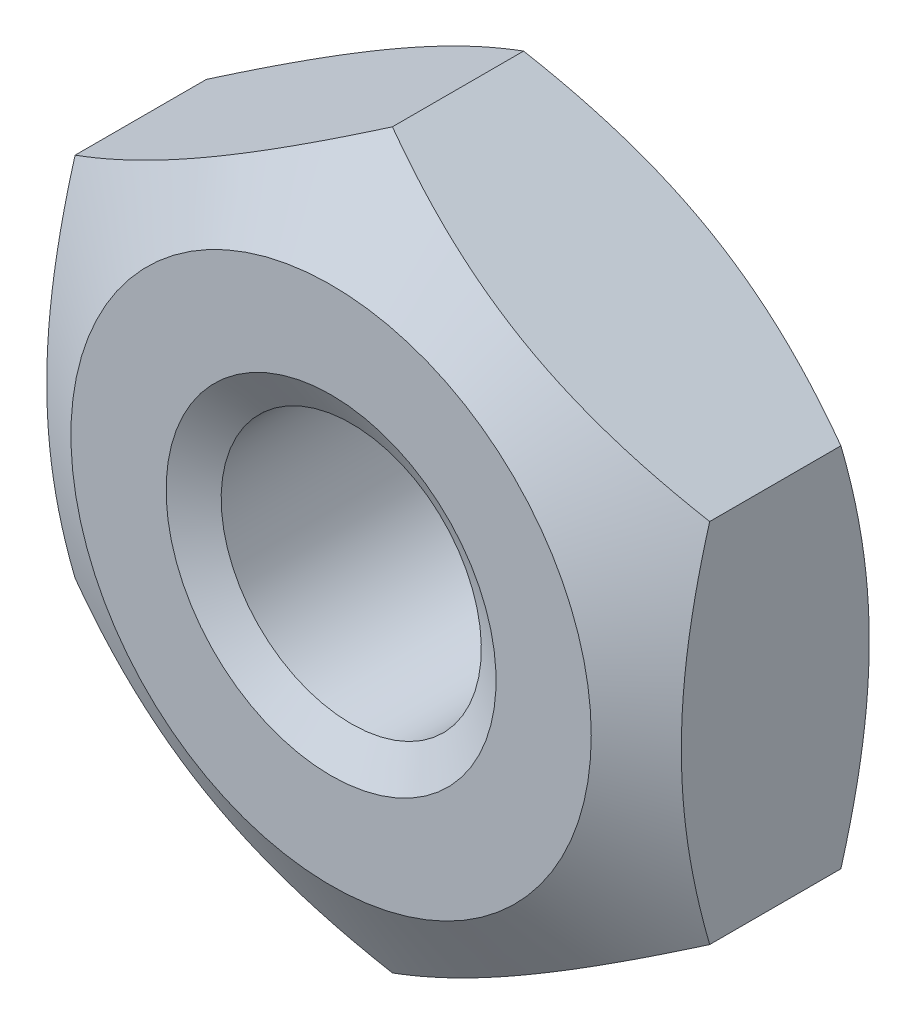
ISO-10303-21;
HEADER;
FILE_DESCRIPTION(('STEP AP214'),'2;1');
FILE_NAME('part.step','',(''),(''),'','','');
FILE_SCHEMA(('AUTOMOTIVE_DESIGN { 1 0 10303 214 1 1 1 1 }'));
ENDSEC;
DATA;
#1=APPLICATION_CONTEXT('core data for automotive mechanical design processes');
#2=APPLICATION_PROTOCOL_DEFINITION('international standard','automotive_design',2000,#1);
#3=PRODUCT_CONTEXT('',#1,'mechanical');
#4=PRODUCT('Part','Part','',(#3));
#5=PRODUCT_RELATED_PRODUCT_CATEGORY('part','',(#4));
#6=PRODUCT_DEFINITION_FORMATION('','',#4);
#7=PRODUCT_DEFINITION_CONTEXT('part definition',#1,'design');
#8=PRODUCT_DEFINITION('design','',#6,#7);
#9=PRODUCT_DEFINITION_SHAPE('','',#8);
#10=(LENGTH_UNIT() NAMED_UNIT(*) SI_UNIT(.MILLI.,.METRE.));
#11=(NAMED_UNIT(*) PLANE_ANGLE_UNIT() SI_UNIT($,.RADIAN.));
#12=(NAMED_UNIT(*) SI_UNIT($,.STERADIAN.) SOLID_ANGLE_UNIT());
#13=UNCERTAINTY_MEASURE_WITH_UNIT(LENGTH_MEASURE(1.E-05),#10,'distance_accuracy_value','');
#14=(GEOMETRIC_REPRESENTATION_CONTEXT(3) GLOBAL_UNCERTAINTY_ASSIGNED_CONTEXT((#13)) GLOBAL_UNIT_ASSIGNED_CONTEXT((#10,
#11,#12)) REPRESENTATION_CONTEXT('',''));
#15=CARTESIAN_POINT('',(0.,0.,0.));
#16=DIRECTION('',(0.,0.,1.));
#17=DIRECTION('',(1.,0.,0.));
#18=AXIS2_PLACEMENT_3D('',#15,#16,#17);
#19=CARTESIAN_POINT('',(0.,0.,0.));
#20=DIRECTION('',(0.,0.,1.));
#21=DIRECTION('',(1.,0.,0.));
#22=AXIS2_PLACEMENT_3D('',#19,#20,#21);
#23=PLANE('',#22);
#24=CARTESIAN_POINT('',(0.,0.,0.));
#25=DIRECTION('',(0.,0.,1.));
#26=DIRECTION('',(0.,-1.,0.));
#27=AXIS2_PLACEMENT_3D('',#24,#25,#26);
#28=CIRCLE('',#27,1.3);
#29=CARTESIAN_POINT('',(0.,-1.29999999999999,0.));
#30=VERTEX_POINT('',#29);
#31=EDGE_CURVE('E264',#30,#30,#28,.T.);
#32=ORIENTED_EDGE('',*,*,#31,.F.);
#33=EDGE_LOOP('',(#32));
#34=FACE_BOUND('',#33,.T.);
#35=CARTESIAN_POINT('',(0.,0.,0.));
#36=DIRECTION('',(0.,0.,1.));
#37=DIRECTION('',(1.,0.,0.));
#38=AXIS2_PLACEMENT_3D('',#35,#36,#37);
#39=CIRCLE('',#38,2.05);
#40=CARTESIAN_POINT('',(2.05,0.,0.));
#41=VERTEX_POINT('',#40);
#42=EDGE_CURVE('E223',#41,#41,#39,.T.);
#43=ORIENTED_EDGE('',*,*,#42,.T.);
#44=EDGE_LOOP('',(#43));
#45=FACE_BOUND('',#44,.T.);
#46=ADVANCED_FACE('F36',(#34,#45),#23,.T.);
#47=CARTESIAN_POINT('',(0.,0.,0.));
#48=DIRECTION('',(0.,0.,-1.));
#49=DIRECTION('',(-1.,0.,0.));
#50=AXIS2_PLACEMENT_3D('',#47,#48,#49);
#51=CONICAL_SURFACE('',#50,2.05,1.0471975511966);
#52=CARTESIAN_POINT('',(-2.5002,1.44326020292024,-0.48316528549444));
#53=CARTESIAN_POINT('',(-2.39033676526512,1.50668977106846,-0.446529241242958));
#54=CARTESIAN_POINT('',(-2.27952520010347,1.57066685804387,-0.413209840100388));
#55=CARTESIAN_POINT('',(-2.05598316653394,1.69972891130043,-0.35504990669319));
#56=CARTESIAN_POINT('',(-1.9432487254716,1.76481617119471,-0.330229950283071));
#57=CARTESIAN_POINT('',(-1.71917700612472,1.89418403867741,-0.291593272576385));
#58=CARTESIAN_POINT('',(-1.60787420823261,1.95844473900198,-0.277519417320972));
#59=CARTESIAN_POINT('',(-1.38474477253166,2.08726857876806,-0.260716773488084));
#60=CARTESIAN_POINT('',(-1.27291894598576,2.15183124982668,-0.25797407233896));
#61=CARTESIAN_POINT('',(-1.06395802444847,2.27247489412635,-0.263673381143387));
#62=CARTESIAN_POINT('',(-0.966791682442261,2.3285739078398,-0.270716015517195));
#63=CARTESIAN_POINT('',(-0.773092050288991,2.44040644260542,-0.293039040260275));
#64=CARTESIAN_POINT('',(-0.676559430340262,2.4961395767184,-0.308327059575599));
#65=CARTESIAN_POINT('',(-0.482460278259519,2.60820277442169,-0.346546714979751));
#66=CARTESIAN_POINT('',(-0.384918318217856,2.66451865130903,-0.369640397260847));
#67=CARTESIAN_POINT('',(-0.191289391923913,2.77631036402773,-0.422054277713241));
#68=CARTESIAN_POINT('',(-0.0951999441138227,2.83178763258717,-0.451362156759875));
#69=CARTESIAN_POINT('',(0.000200000000000249,2.88686681600196,-0.483165285494434));
#70=B_SPLINE_CURVE_WITH_KNOTS('',3,(#52,#53,#54,#55,#56,#57,#58,#59,#60,#61,#62,#63,#64,#65,#66,
#67,#68,#69),.UNSPECIFIED.,.F.,.F.,(4,2,2,2,2,2,2,2,4),(0.,0.396285827362227,0.793524330152051,
1.18093086852114,1.56786160134475,1.90479741793733,2.24204551660462,2.58677531536755,
2.93082800105255),.UNSPECIFIED.);
#71=CARTESIAN_POINT('',(-2.5,1.44337567297408,-0.483098614827935));
#72=VERTEX_POINT('',#71);
#73=CARTESIAN_POINT('',(0.,2.88675134594812,-0.483098614827928));
#74=VERTEX_POINT('',#73);
#75=EDGE_CURVE('E218',#72,#74,#70,.T.);
#76=ORIENTED_EDGE('',*,*,#75,.F.);
#77=CARTESIAN_POINT('',(-2.50000000000003,-3.7921269817919,-1.43878630039478));
#78=CARTESIAN_POINT('',(-2.50000000000003,-3.68360819419979,-1.38649250525917));
#79=CARTESIAN_POINT('',(-2.50000000000003,-3.57483093242934,-1.33472540231785));
#80=CARTESIAN_POINT('',(-2.50000000000003,-3.35662163311487,-1.23254270131456));
#81=CARTESIAN_POINT('',(-2.50000000000003,-3.24718948723902,-1.18212733486711));
#82=CARTESIAN_POINT('',(-2.50000000000003,-3.0269268935093,-1.08267410936104));
#83=CARTESIAN_POINT('',(-2.50000000000003,-2.91609201043438,-1.03364603733657));
#84=CARTESIAN_POINT('',(-2.50000000000003,-2.69351024653324,-0.93771366134557));
#85=CARTESIAN_POINT('',(-2.50000000000002,-2.58176341184402,-0.890809250716362));
#86=CARTESIAN_POINT('',(-2.50000000000002,-2.35393863753696,-0.798372730143281));
#87=CARTESIAN_POINT('',(-2.50000000000002,-2.23782867443053,-0.75291909527758));
#88=CARTESIAN_POINT('',(-2.50000000000002,-2.00421937372528,-0.66566233065449));
#89=CARTESIAN_POINT('',(-2.50000000000002,-1.88671987763637,-0.62385962197148));
#90=CARTESIAN_POINT('',(-2.50000000000002,-1.65039343421221,-0.545064724983018));
#91=CARTESIAN_POINT('',(-2.50000000000002,-1.53157003228562,-0.508062014902248));
#92=CARTESIAN_POINT('',(-2.50000000000001,-1.29222201525114,-0.440109887291416));
#93=CARTESIAN_POINT('',(-2.50000000000001,-1.17169797604213,-0.409158470924412));
#94=CARTESIAN_POINT('',(-2.50000000000001,-0.929521082816305,-0.355005530657451));
#95=CARTESIAN_POINT('',(-2.50000000000001,-0.807876882979509,-0.331766040628526));
#96=CARTESIAN_POINT('',(-2.50000000000001,-0.563169443541158,-0.294410848543932));
#97=CARTESIAN_POINT('',(-2.50000000000001,-0.440106312567164,-0.280294452720251));
#98=CARTESIAN_POINT('',(-2.50000000000001,-0.194745277219483,-0.262496926340283));
#99=CARTESIAN_POINT('',(-2.50000000000001,-0.0724568435156071,-0.258688404708268));
#100=CARTESIAN_POINT('',(-2.5,0.17200780348228,-0.261498957731729));
#101=CARTESIAN_POINT('',(-2.5,0.294184012050238,-0.268118453049466));
#102=CARTESIAN_POINT('',(-2.5,0.504206888974868,-0.288006807688305));
#103=CARTESIAN_POINT('',(-2.5,0.592284852724272,-0.298955989442029));
#104=CARTESIAN_POINT('',(-2.5,0.767736640735611,-0.325543939985937));
#105=CARTESIAN_POINT('',(-2.5,0.855110355995737,-0.341183420940635));
#106=CARTESIAN_POINT('',(-2.5,1.11608150013205,-0.394310701102382));
#107=CARTESIAN_POINT('',(-2.5,1.28841982922292,-0.437995705527644));
#108=CARTESIAN_POINT('',(-2.49999999999999,1.63319507258211,-0.538310530129978));
#109=CARTESIAN_POINT('',(-2.49999999999999,1.8055532783089,-0.595200225555468));
#110=CARTESIAN_POINT('',(-2.49999999999999,2.14711183996029,-0.717498880815936));
#111=CARTESIAN_POINT('',(-2.49999999999999,2.31631320938192,-0.782905050706423));
#112=CARTESIAN_POINT('',(-2.49999999999999,2.59299712145565,-0.895512640293348));
#113=CARTESIAN_POINT('',(-2.49999999999999,2.70119085712378,-0.940994238651021));
#114=CARTESIAN_POINT('',(-2.49999999999998,2.91672148538422,-1.03394823396382));
#115=CARTESIAN_POINT('',(-2.49999999999998,3.02405836362257,-1.08142066418611));
#116=CARTESIAN_POINT('',(-2.49999999999998,3.34503324191087,-1.22622555547707));
#117=CARTESIAN_POINT('',(-2.49999999999998,3.5575987877451,-1.32593034995251));
#118=CARTESIAN_POINT('',(-2.49999999999998,3.9808879083803,-1.52960150502348));
#119=CARTESIAN_POINT('',(-2.49999999999998,4.19160970797467,-1.63357151951237));
#120=CARTESIAN_POINT('',(-2.49999999999997,4.61159827267531,-1.84441771761189));
#121=CARTESIAN_POINT('',(-2.49999999999997,4.82086499524757,-1.9512939857318));
#122=CARTESIAN_POINT('',(-2.49999999999997,5.22194489802532,-2.15865703653318));
#123=CARTESIAN_POINT('',(-2.49999999999997,5.41383928810987,-2.25898724130076));
#124=CARTESIAN_POINT('',(-2.49999999999996,5.79692903660451,-2.46098529043429));
#125=CARTESIAN_POINT('',(-2.49999999999996,5.98812437472892,-2.56265317323055));
#126=CARTESIAN_POINT('',(-2.49999999999996,6.36955677188862,-2.76679618594544));
#127=CARTESIAN_POINT('',(-2.49999999999996,6.55979500596572,-2.86926912344229));
#128=CARTESIAN_POINT('',(-2.49999999999996,6.93982123367475,-3.0750254280534));
#129=CARTESIAN_POINT('',(-2.49999999999995,7.12960924820955,-3.17830875654413));
#130=CARTESIAN_POINT('',(-2.49999999999995,7.31922976990392,-3.28189662814873));
#131=B_SPLINE_CURVE_WITH_KNOTS('',3,(#77,#78,#79,#80,#81,#82,#83,#84,#85,#86,#87,#88,#89,#90,
#91,#92,#93,#94,#95,#96,#97,#98,#99,#100,#101,#102,#103,#104,#105,#106,#107,#108,#109,#110,#111,
#112,#113,#114,#115,#116,#117,#118,#119,#120,#121,#122,#123,#124,#125,#126,#127,#128,#129,#130),
.UNSPECIFIED.,.F.,.F.,(4,2,2,2,2,2,2,2,2,2,2,2,2,2,2,2,2,2,2,2,2,2,2,2,2,2,4),(0.,
0.361389297258786,0.722840126413439,1.0864060447768,1.44995368243466,1.8239758126449,
2.1980410233567,2.5712718910373,2.94437926565972,3.31562158220116,3.68683566420361,
4.05344064305347,4.42006041098822,4.68619830245561,4.9523766241806,5.4850609122767,
6.02928244820743,6.57332614696784,6.92540217640994,7.27748409145408,7.98176710566398,
8.68666660177973,9.3915866172274,10.041200667763,10.6908334220608,11.3390763206185,
11.9872885091277),.UNSPECIFIED.);
#132=CARTESIAN_POINT('',(-2.50000000000002,-1.44337567297406,-0.483098614827935));
#133=VERTEX_POINT('',#132);
#134=EDGE_CURVE('E186',#133,#72,#131,.T.);
#135=ORIENTED_EDGE('',*,*,#134,.F.);
#136=CARTESIAN_POINT('',(0.000199999999992317,-2.88686681600196,-0.483165285494434));
#137=CARTESIAN_POINT('',(-0.109663234734878,-2.82343724785374,-0.446529241242952));
#138=CARTESIAN_POINT('',(-0.220474799896532,-2.75946016087834,-0.413209840100383));
#139=CARTESIAN_POINT('',(-0.444016833466055,-2.63039810762177,-0.355049906693185));
#140=CARTESIAN_POINT('',(-0.556751274528393,-2.56531084772749,-0.330229950283065));
#141=CARTESIAN_POINT('',(-0.780822993875272,-2.43594298024479,-0.291593272576379));
#142=CARTESIAN_POINT('',(-0.89212579176738,-2.37168227992022,-0.277519417320966));
#143=CARTESIAN_POINT('',(-1.11525522746834,-2.24285844015414,-0.260716773488077));
#144=CARTESIAN_POINT('',(-1.22708105401423,-2.17829576909552,-0.257974072338954));
#145=CARTESIAN_POINT('',(-1.43604197555152,-2.05765212479585,-0.26367338114338));
#146=CARTESIAN_POINT('',(-1.53320831755773,-2.00155311108239,-0.270716015517188));
#147=CARTESIAN_POINT('',(-1.72690794971101,-1.88972057631676,-0.293039040260269));
#148=CARTESIAN_POINT('',(-1.82344056965974,-1.83398744220378,-0.308327059575594));
#149=CARTESIAN_POINT('',(-2.01753972174049,-1.72192424450049,-0.346546714979748));
#150=CARTESIAN_POINT('',(-2.11508168178215,-1.66560836761315,-0.369640397260845));
#151=CARTESIAN_POINT('',(-2.3087106080761,-1.55381665489444,-0.422054277713242));
#152=CARTESIAN_POINT('',(-2.40480005588619,-1.498339386335,-0.451362156759878));
#153=CARTESIAN_POINT('',(-2.50020000000002,-1.4432602029202,-0.483165285494438));
#154=B_SPLINE_CURVE_WITH_KNOTS('',3,(#136,#137,#138,#139,#140,#141,#142,#143,#144,#145,#146,
#147,#148,#149,#150,#151,#152,#153),.UNSPECIFIED.,.F.,.F.,(4,2,2,2,2,2,2,2,4),(0.,
0.396285827362226,0.793524330152048,1.18093086852114,1.56786160134475,1.90479741793733,
2.24204551660463,2.58677531536757,2.93082800105258),.UNSPECIFIED.);
#155=CARTESIAN_POINT('',(0.,-2.88675134594814,-0.483098614827935));
#156=VERTEX_POINT('',#155);
#157=EDGE_CURVE('E178',#156,#133,#154,.T.);
#158=ORIENTED_EDGE('',*,*,#157,.F.);
#159=CARTESIAN_POINT('',(2.50019999999999,-1.44326020292025,-0.483165285494439));
#160=CARTESIAN_POINT('',(2.39033676526512,-1.50668977106847,-0.446529241242956));
#161=CARTESIAN_POINT('',(2.27952520010346,-1.57066685804388,-0.413209840100387));
#162=CARTESIAN_POINT('',(2.05598316653394,-1.69972891130044,-0.355049906693189));
#163=CARTESIAN_POINT('',(1.9432487254716,-1.76481617119472,-0.33022995028307));
#164=CARTESIAN_POINT('',(1.71917700612472,-1.89418403867742,-0.291593272576384));
#165=CARTESIAN_POINT('',(1.60787420823261,-1.95844473900199,-0.277519417320972));
#166=CARTESIAN_POINT('',(1.38474477253165,-2.08726857876806,-0.260716773488083));
#167=CARTESIAN_POINT('',(1.27291894598576,-2.15183124982668,-0.25797407233896));
#168=CARTESIAN_POINT('',(1.06395802444846,-2.27247489412635,-0.263673381143387));
#169=CARTESIAN_POINT('',(0.966791682442253,-2.3285739078398,-0.270716015517194));
#170=CARTESIAN_POINT('',(0.773092050288983,-2.44040644260542,-0.293039040260274));
#171=CARTESIAN_POINT('',(0.676559430340254,-2.4961395767184,-0.308327059575599));
#172=CARTESIAN_POINT('',(0.482460278259512,-2.60820277442169,-0.346546714979751));
#173=CARTESIAN_POINT('',(0.384918318217849,-2.66451865130903,-0.369640397260847));
#174=CARTESIAN_POINT('',(0.191289391923906,-2.77631036402773,-0.422054277713241));
#175=CARTESIAN_POINT('',(0.0951999441138156,-2.83178763258717,-0.451362156759875));
#176=CARTESIAN_POINT('',(-0.000200000000007523,-2.88686681600196,-0.483165285494434));
#177=B_SPLINE_CURVE_WITH_KNOTS('',3,(#159,#160,#161,#162,#163,#164,#165,#166,#167,#168,#169,
#170,#171,#172,#173,#174,#175,#176),.UNSPECIFIED.,.F.,.F.,(4,2,2,2,2,2,2,2,4),(0.,
0.396285827362227,0.793524330152051,1.18093086852114,1.56786160134475,1.90479741793732,
2.24204551660462,2.58677531536754,2.93082800105254),.UNSPECIFIED.);
#178=CARTESIAN_POINT('',(2.5,-1.44337567297408,-0.483098614827935));
#179=VERTEX_POINT('',#178);
#180=EDGE_CURVE('E94',#179,#156,#177,.T.);
#181=ORIENTED_EDGE('',*,*,#180,.F.);
#182=CARTESIAN_POINT('',(2.49999999999997,-3.7921269818455,-1.43878630042059));
#183=CARTESIAN_POINT('',(2.49999999999997,-3.68360819425159,-1.3864925052839));
#184=CARTESIAN_POINT('',(2.49999999999997,-3.57483093247934,-1.33472540234149));
#185=CARTESIAN_POINT('',(2.49999999999997,-3.35662163316128,-1.23254270133603));
#186=CARTESIAN_POINT('',(2.49999999999998,-3.24718948728362,-1.18212733488749));
#187=CARTESIAN_POINT('',(2.49999999999998,-3.02692689355027,-1.08267410937926));
#188=CARTESIAN_POINT('',(2.49999999999998,-2.91609201047351,-1.03364603735371));
#189=CARTESIAN_POINT('',(2.49999999999998,-2.6935102465687,-0.937713661360553));
#190=CARTESIAN_POINT('',(2.49999999999998,-2.58176341187763,-0.890809250730278));
#191=CARTESIAN_POINT('',(2.49999999999998,-2.35393863756677,-0.79837273015505));
#192=CARTESIAN_POINT('',(2.49999999999998,-2.23782867445837,-0.75291909528827));
#193=CARTESIAN_POINT('',(2.49999999999998,-2.00421937374916,-0.665662330663084));
#194=CARTESIAN_POINT('',(2.49999999999999,-1.88671987765825,-0.623859621979055));
#195=CARTESIAN_POINT('',(2.49999999999999,-1.65039343423006,-0.54506472498866));
#196=CARTESIAN_POINT('',(2.49999999999999,-1.53157003230144,-0.508062014906974));
#197=CARTESIAN_POINT('',(2.49999999999999,-1.29222201526282,-0.44010988729447));
#198=CARTESIAN_POINT('',(2.49999999999999,-1.17169797605173,-0.409158470926709));
#199=CARTESIAN_POINT('',(2.49999999999999,-0.929521082820576,-0.355005530658232));
#200=CARTESIAN_POINT('',(2.49999999999999,-0.807876882980536,-0.331766040628615));
#201=CARTESIAN_POINT('',(2.49999999999999,-0.563169443535626,-0.294410848543136));
#202=CARTESIAN_POINT('',(2.5,-0.440106312558316,-0.280294452719263));
#203=CARTESIAN_POINT('',(2.5,-0.194745277204063,-0.262496926339493));
#204=CARTESIAN_POINT('',(2.5,-0.0724568434969307,-0.25868840470786));
#205=CARTESIAN_POINT('',(2.5,0.172007803507411,-0.261498957732634));
#206=CARTESIAN_POINT('',(2.5,0.294184012078567,-0.2681184530513));
#207=CARTESIAN_POINT('',(2.5,0.504206889007321,-0.288006807691996));
#208=CARTESIAN_POINT('',(2.5,0.592284852757687,-0.298955989446468));
#209=CARTESIAN_POINT('',(2.5,0.76773664077091,-0.325543939991914));
#210=CARTESIAN_POINT('',(2.5,0.855110356031959,-0.341183420947402));
#211=CARTESIAN_POINT('',(2.50000000000001,1.116081500171,-0.394310701111537));
#212=CARTESIAN_POINT('',(2.50000000000001,1.28841982926361,-0.437995705538415));
#213=CARTESIAN_POINT('',(2.50000000000001,1.63319507262632,-0.538310530143951));
#214=CARTESIAN_POINT('',(2.50000000000001,1.80555327835487,-0.595200225571028));
#215=CARTESIAN_POINT('',(2.50000000000001,2.14711184000977,-0.717498880834575));
#216=CARTESIAN_POINT('',(2.50000000000002,2.31631320943316,-0.782905050726551));
#217=CARTESIAN_POINT('',(2.50000000000002,2.59299712150841,-0.895512640315304));
#218=CARTESIAN_POINT('',(2.50000000000002,2.70119085717631,-0.940994238673306));
#219=CARTESIAN_POINT('',(2.50000000000002,2.91672148543633,-1.03394823398669));
#220=CARTESIAN_POINT('',(2.50000000000002,3.02405836367448,-1.08142066420923));
#221=CARTESIAN_POINT('',(2.50000000000002,3.34503324196222,-1.22622555550087));
#222=CARTESIAN_POINT('',(2.50000000000002,3.55759878779611,-1.32593034997665));
#223=CARTESIAN_POINT('',(2.50000000000003,3.98088790843069,-1.52960150504816));
#224=CARTESIAN_POINT('',(2.50000000000003,4.19160970802477,-1.63357151953725));
#225=CARTESIAN_POINT('',(2.50000000000003,4.61159827272488,-1.84441771763708));
#226=CARTESIAN_POINT('',(2.50000000000003,4.82086499529689,-1.95129398575711));
#227=CARTESIAN_POINT('',(2.50000000000004,5.22194489807436,-2.15865703655874));
#228=CARTESIAN_POINT('',(2.50000000000004,5.41383928815888,-2.25898724132647));
#229=CARTESIAN_POINT('',(2.50000000000004,5.79692903665347,-2.46098529046028));
#230=CARTESIAN_POINT('',(2.50000000000004,5.98812437477787,-2.56265317325665));
#231=CARTESIAN_POINT('',(2.50000000000004,6.36955677193757,-2.76679618597177));
#232=CARTESIAN_POINT('',(2.50000000000005,6.5597950060147,-2.86926912346874));
#233=CARTESIAN_POINT('',(2.50000000000005,6.93982123372379,-3.07502542808005));
#234=CARTESIAN_POINT('',(2.50000000000005,7.12960924825861,-3.17830875657088));
#235=CARTESIAN_POINT('',(2.50000000000005,7.31922976995302,-3.28189662817557));
#236=B_SPLINE_CURVE_WITH_KNOTS('',3,(#182,#183,#184,#185,#186,#187,#188,#189,#190,#191,#192,
#193,#194,#195,#196,#197,#198,#199,#200,#201,#202,#203,#204,#205,#206,#207,#208,#209,#210,#211,
#212,#213,#214,#215,#216,#217,#218,#219,#220,#221,#222,#223,#224,#225,#226,#227,#228,#229,#230,
#231,#232,#233,#234,#235),.UNSPECIFIED.,.F.,.F.,(4,2,2,2,2,2,2,2,2,2,2,2,2,2,2,2,2,2,2,2,2,2,2,
2,2,2,4),(0.,0.361389297265054,0.722840126425977,1.08640604479568,1.44995368245989,
1.82397581267679,2.19804102339526,2.5712718910825,2.94437926571156,3.31562158226293,
3.68683566427529,4.05344064313484,4.4200604110793,4.68619830254982,4.95237662427795,
5.48506091238034,6.02928244831759,6.57332614708452,6.92540217652639,7.27748409157029,
7.98176710577973,8.68666660189497,9.39158661734212,10.0412006678778,10.6908334221758,
11.3390763207337,11.9872885092431),.UNSPECIFIED.);
#237=CARTESIAN_POINT('',(2.50000000000001,1.44337567297407,-0.483098614827935));
#238=VERTEX_POINT('',#237);
#239=EDGE_CURVE('E90',#238,#179,#236,.F.);
#240=ORIENTED_EDGE('',*,*,#239,.F.);
#241=CARTESIAN_POINT('',(-0.0002,2.88686681600196,-0.483165285494434));
#242=CARTESIAN_POINT('',(0.10966323473487,2.82343724785374,-0.446529241242952));
#243=CARTESIAN_POINT('',(0.220474799896524,2.75946016087834,-0.413209840100382));
#244=CARTESIAN_POINT('',(0.444016833466046,2.63039810762177,-0.355049906693183));
#245=CARTESIAN_POINT('',(0.556751274528384,2.56531084772749,-0.330229950283063));
#246=CARTESIAN_POINT('',(0.780822993875262,2.43594298024478,-0.291593272576376));
#247=CARTESIAN_POINT('',(0.89212579176737,2.37168227992022,-0.277519417320962));
#248=CARTESIAN_POINT('',(1.11525522746832,2.24285844015414,-0.260716773488072));
#249=CARTESIAN_POINT('',(1.22708105401422,2.17829576909551,-0.257974072338948));
#250=CARTESIAN_POINT('',(1.43604197555151,2.05765212479584,-0.263673381143374));
#251=CARTESIAN_POINT('',(1.53320831755772,2.00155311108238,-0.270716015517181));
#252=CARTESIAN_POINT('',(1.726907949711,1.88972057631676,-0.293039040260262));
#253=CARTESIAN_POINT('',(1.82344056965973,1.83398744220377,-0.308327059575587));
#254=CARTESIAN_POINT('',(2.01753972174048,1.72192424450048,-0.34654671497974));
#255=CARTESIAN_POINT('',(2.11508168178214,1.66560836761313,-0.369640397260837));
#256=CARTESIAN_POINT('',(2.30871060807609,1.55381665489442,-0.422054277713234));
#257=CARTESIAN_POINT('',(2.40480005588618,1.49833938633498,-0.45136215675987));
#258=CARTESIAN_POINT('',(2.50020000000001,1.44326020292019,-0.483165285494431));
#259=B_SPLINE_CURVE_WITH_KNOTS('',3,(#241,#242,#243,#244,#245,#246,#247,#248,#249,#250,#251,
#252,#253,#254,#255,#256,#257,#258),.UNSPECIFIED.,.F.,.F.,(4,2,2,2,2,2,2,2,4),(0.,
0.396285827362225,0.793524330152049,1.18093086852114,1.56786160134475,1.90479741793733,
2.24204551660464,2.58677531536758,2.93082800105259),.UNSPECIFIED.);
#260=EDGE_CURVE('E62',#74,#238,#259,.T.);
#261=ORIENTED_EDGE('',*,*,#260,.F.);
#262=EDGE_LOOP('',(#76,#135,#158,#181,#240,#261));
#263=FACE_BOUND('',#262,.T.);
#264=ORIENTED_EDGE('',*,*,#42,.F.);
#265=EDGE_LOOP('',(#264));
#266=FACE_BOUND('',#265,.T.);
#267=ADVANCED_FACE('F91',(#263,#266),#51,.T.);
#268=CARTESIAN_POINT('',(2.50000000000001,1.44337567297403,-2.));
#269=DIRECTION('',(0.500000000000007,0.866025403784435,0.));
#270=DIRECTION('',(-0.866025403784435,0.500000000000007,0.));
#271=AXIS2_PLACEMENT_3D('',#268,#269,#270);
#272=PLANE('',#271);
#273=DIRECTION('',(0.,0.,1.));
#274=VECTOR('',#273,1.);
#275=CARTESIAN_POINT('',(2.50000000000001,1.44337567297403,-2.));
#276=LINE('',#275,#274);
#277=CARTESIAN_POINT('',(2.50000000000001,1.44337567297404,-1.51690138517207));
#278=VERTEX_POINT('',#277);
#279=EDGE_CURVE('E11',#278,#238,#276,.T.);
#280=ORIENTED_EDGE('',*,*,#279,.F.);
#281=CARTESIAN_POINT('',(2.50020000000001,1.44326020292019,-1.51683471450557));
#282=CARTESIAN_POINT('',(2.39033676526514,1.50668977106841,-1.55347075875705));
#283=CARTESIAN_POINT('',(2.27952520010349,1.57066685804382,-1.58679015989962));
#284=CARTESIAN_POINT('',(2.05598316653396,1.69972891130038,-1.64495009330682));
#285=CARTESIAN_POINT('',(1.94324872547163,1.76481617119466,-1.66977004971694));
#286=CARTESIAN_POINT('',(1.71917700612475,1.89418403867737,-1.70840672742362));
#287=CARTESIAN_POINT('',(1.60787420823264,1.95844473900194,-1.72248058267904));
#288=CARTESIAN_POINT('',(1.38474477253168,2.08726857876801,-1.73928322651193));
#289=CARTESIAN_POINT('',(1.27291894598579,2.15183124982664,-1.74202592766105));
#290=CARTESIAN_POINT('',(1.0639580244485,2.27247489412631,-1.73632661885662));
#291=CARTESIAN_POINT('',(0.966791682442286,2.32857390783977,-1.72928398448282));
#292=CARTESIAN_POINT('',(0.773092050289011,2.4404064426054,-1.70696095973974));
#293=CARTESIAN_POINT('',(0.67655943034028,2.49613957671838,-1.69167294042441));
#294=CARTESIAN_POINT('',(0.482460278259533,2.60820277442168,-1.65345328502026));
#295=CARTESIAN_POINT('',(0.384918318217866,2.66451865130902,-1.63035960273916));
#296=CARTESIAN_POINT('',(0.191289391923919,2.77631036402773,-1.57794572228676));
#297=CARTESIAN_POINT('',(0.0951999441138261,2.83178763258717,-1.54863784324012));
#298=CARTESIAN_POINT('',(-0.000199999999999743,2.88686681600196,-1.51683471450556));
#299=B_SPLINE_CURVE_WITH_KNOTS('',3,(#281,#282,#283,#284,#285,#286,#287,#288,#289,#290,#291,
#292,#293,#294,#295,#296,#297,#298),.UNSPECIFIED.,.F.,.F.,(4,2,2,2,2,2,2,2,4),(0.,
0.396285827362226,0.793524330152049,1.18093086852114,1.56786160134475,1.90479741793733,
2.24204551660464,2.58677531536758,2.93082800105259),.UNSPECIFIED.);
#300=CARTESIAN_POINT('',(0.,2.88675134594812,-1.51690138517207));
#301=VERTEX_POINT('',#300);
#302=EDGE_CURVE('E110',#278,#301,#299,.T.);
#303=ORIENTED_EDGE('',*,*,#302,.T.);
#304=DIRECTION('',(0.,0.,1.));
#305=VECTOR('',#304,1.);
#306=CARTESIAN_POINT('',(0.,2.88675134594812,-2.));
#307=LINE('',#306,#305);
#308=EDGE_CURVE('E41',#301,#74,#307,.T.);
#309=ORIENTED_EDGE('',*,*,#308,.T.);
#310=ORIENTED_EDGE('',*,*,#260,.T.);
#311=EDGE_LOOP('',(#280,#303,#309,#310));
#312=FACE_BOUND('',#311,.T.);
#313=ADVANCED_FACE('F38',(#312),#272,.T.);
#314=CARTESIAN_POINT('',(2.49999999999999,-1.44337567297409,-2.));
#315=DIRECTION('',(1.,0.,0.));
#316=DIRECTION('',(0.,1.,0.));
#317=AXIS2_PLACEMENT_3D('',#314,#315,#316);
#318=PLANE('',#317);
#319=DIRECTION('',(0.,0.,1.));
#320=VECTOR('',#319,1.);
#321=CARTESIAN_POINT('',(2.49999999999999,-1.44337567297409,-2.));
#322=LINE('',#321,#320);
#323=CARTESIAN_POINT('',(2.49999999999998,-1.4433756729741,-1.51690138517207));
#324=VERTEX_POINT('',#323);
#325=EDGE_CURVE('E46',#324,#179,#322,.T.);
#326=ORIENTED_EDGE('',*,*,#325,.F.);
#327=CARTESIAN_POINT('',(2.49999999999997,-3.7921269818455,-0.561213699579393));
#328=CARTESIAN_POINT('',(2.49999999999997,-3.68360819425159,-0.613507494716089));
#329=CARTESIAN_POINT('',(2.49999999999997,-3.57483093247934,-0.665274597658497));
#330=CARTESIAN_POINT('',(2.49999999999997,-3.35662163316127,-0.767457298663959));
#331=CARTESIAN_POINT('',(2.49999999999998,-3.24718948728362,-0.817872665112497));
#332=CARTESIAN_POINT('',(2.49999999999998,-3.02692689355027,-0.917325890620729));
#333=CARTESIAN_POINT('',(2.49999999999998,-2.91609201047351,-0.966353962646283));
#334=CARTESIAN_POINT('',(2.49999999999998,-2.6935102465687,-1.06228633863944));
#335=CARTESIAN_POINT('',(2.49999999999998,-2.58176341187763,-1.10919074926971));
#336=CARTESIAN_POINT('',(2.49999999999998,-2.35393863756677,-1.20162726984494));
#337=CARTESIAN_POINT('',(2.49999999999998,-2.23782867445837,-1.24708090471172));
#338=CARTESIAN_POINT('',(2.49999999999998,-2.00421937374916,-1.33433766933691));
#339=CARTESIAN_POINT('',(2.49999999999999,-1.88671987765825,-1.37614037802094));
#340=CARTESIAN_POINT('',(2.49999999999999,-1.65039343423006,-1.45493527501134));
#341=CARTESIAN_POINT('',(2.49999999999999,-1.53157003230144,-1.49193798509302));
#342=CARTESIAN_POINT('',(2.49999999999999,-1.29222201526282,-1.55989011270553));
#343=CARTESIAN_POINT('',(2.49999999999999,-1.17169797605173,-1.59084152907329));
#344=CARTESIAN_POINT('',(2.49999999999999,-0.929521082820575,-1.64499446934177));
#345=CARTESIAN_POINT('',(2.49999999999999,-0.807876882980535,-1.66823395937138));
#346=CARTESIAN_POINT('',(2.49999999999999,-0.563169443535624,-1.70558915145686));
#347=CARTESIAN_POINT('',(2.5,-0.440106312558314,-1.71970554728074));
#348=CARTESIAN_POINT('',(2.5,-0.19474527720406,-1.73750307366051));
#349=CARTESIAN_POINT('',(2.5,-0.0724568434969278,-1.74131159529214));
#350=CARTESIAN_POINT('',(2.5,0.172007803507414,-1.73850104226737));
#351=CARTESIAN_POINT('',(2.5,0.29418401207857,-1.7318815469487));
#352=CARTESIAN_POINT('',(2.5,0.504206889007323,-1.711993192308));
#353=CARTESIAN_POINT('',(2.5,0.592284852757688,-1.70104401055353));
#354=CARTESIAN_POINT('',(2.5,0.767736640770909,-1.67445606000808));
#355=CARTESIAN_POINT('',(2.5,0.855110356031957,-1.6588165790526));
#356=CARTESIAN_POINT('',(2.50000000000001,1.11608150017099,-1.60568929888846));
#357=CARTESIAN_POINT('',(2.50000000000001,1.28841982926361,-1.56200429446158));
#358=CARTESIAN_POINT('',(2.50000000000001,1.63319507262631,-1.46168946985605));
#359=CARTESIAN_POINT('',(2.50000000000001,1.80555327835485,-1.40479977442897));
#360=CARTESIAN_POINT('',(2.50000000000001,2.14711184000975,-1.28250111916543));
#361=CARTESIAN_POINT('',(2.50000000000002,2.31631320943314,-1.21709494927345));
#362=CARTESIAN_POINT('',(2.50000000000002,2.59299712150838,-1.1044873596847));
#363=CARTESIAN_POINT('',(2.50000000000002,2.70119085717629,-1.0590057613267));
#364=CARTESIAN_POINT('',(2.50000000000002,2.9167214854363,-0.966051766013316));
#365=CARTESIAN_POINT('',(2.50000000000002,3.02405836367446,-0.918579335790768));
#366=CARTESIAN_POINT('',(2.50000000000002,3.34503324196219,-0.77377444449913));
#367=CARTESIAN_POINT('',(2.50000000000002,3.55759878779608,-0.674069650023347));
#368=CARTESIAN_POINT('',(2.50000000000003,3.98088790843066,-0.470398494951839));
#369=CARTESIAN_POINT('',(2.50000000000003,4.19160970802474,-0.366428480462753));
#370=CARTESIAN_POINT('',(2.50000000000003,4.61159827272485,-0.155582282362916));
#371=CARTESIAN_POINT('',(2.50000000000003,4.82086499529686,-0.0487060142428898));
#372=CARTESIAN_POINT('',(2.50000000000004,5.22194489807433,0.158657036558749));
#373=CARTESIAN_POINT('',(2.50000000000004,5.41383928815885,0.25898724132648));
#374=CARTESIAN_POINT('',(2.50000000000004,5.79692903665344,0.460985290460286));
#375=CARTESIAN_POINT('',(2.50000000000004,5.98812437477784,0.562653173256661));
#376=CARTESIAN_POINT('',(2.50000000000004,6.36955677193754,0.766796185971783));
#377=CARTESIAN_POINT('',(2.50000000000005,6.55979500601467,0.869269123468753));
#378=CARTESIAN_POINT('',(2.50000000000005,6.93982123372375,1.07502542808007));
#379=CARTESIAN_POINT('',(2.50000000000005,7.12960924825858,1.1783087565709));
#380=CARTESIAN_POINT('',(2.50000000000005,7.31922976995298,1.28189662817559));
#381=B_SPLINE_CURVE_WITH_KNOTS('',3,(#327,#328,#329,#330,#331,#332,#333,#334,#335,#336,#337,
#338,#339,#340,#341,#342,#343,#344,#345,#346,#347,#348,#349,#350,#351,#352,#353,#354,#355,#356,
#357,#358,#359,#360,#361,#362,#363,#364,#365,#366,#367,#368,#369,#370,#371,#372,#373,#374,#375,
#376,#377,#378,#379,#380),.UNSPECIFIED.,.F.,.F.,(4,2,2,2,2,2,2,2,2,2,2,2,2,2,2,2,2,2,2,2,2,2,2,
2,2,2,4),(0.,0.361389297265055,0.722840126425978,1.08640604479568,1.44995368245989,
1.8239758126768,2.19804102339526,2.5712718910825,2.94437926571157,3.31562158226293,
3.6868356642753,4.05344064313485,4.4200604110793,4.68619830254982,4.95237662427795,
5.48506091238033,6.02928244831758,6.57332614708449,6.92540217652637,7.27748409157027,
7.98176710577971,8.68666660189495,9.3915866173421,10.0412006678778,10.6908334221758,
11.3390763207337,11.9872885092431),.UNSPECIFIED.);
#382=EDGE_CURVE('E108',#324,#278,#381,.T.);
#383=ORIENTED_EDGE('',*,*,#382,.T.);
#384=ORIENTED_EDGE('',*,*,#279,.T.);
#385=ORIENTED_EDGE('',*,*,#239,.T.);
#386=EDGE_LOOP('',(#326,#383,#384,#385));
#387=FACE_BOUND('',#386,.T.);
#388=ADVANCED_FACE('F107',(#387),#318,.T.);
#389=CARTESIAN_POINT('',(0.,-2.88675134594812,-2.));
#390=DIRECTION('',(0.499999999999993,-0.866025403784443,0.));
#391=DIRECTION('',(0.866025403784443,0.499999999999993,0.));
#392=AXIS2_PLACEMENT_3D('',#389,#390,#391);
#393=PLANE('',#392);
#394=DIRECTION('',(0.,0.,1.));
#395=VECTOR('',#394,1.);
#396=CARTESIAN_POINT('',(0.,-2.88675134594812,-2.));
#397=LINE('',#396,#395);
#398=CARTESIAN_POINT('',(0.,-2.88675134594812,-1.51690138517207));
#399=VERTEX_POINT('',#398);
#400=EDGE_CURVE('E207',#399,#156,#397,.T.);
#401=ORIENTED_EDGE('',*,*,#400,.F.);
#402=CARTESIAN_POINT('',(-0.000200000000007739,-2.88686681600196,-1.51683471450556));
#403=CARTESIAN_POINT('',(0.109663234734864,-2.82343724785374,-1.55347075875704));
#404=CARTESIAN_POINT('',(0.220474799896519,-2.75946016087834,-1.58679015989961));
#405=CARTESIAN_POINT('',(0.444016833466044,-2.63039810762178,-1.64495009330681));
#406=CARTESIAN_POINT('',(0.556751274528383,-2.5653108477275,-1.66977004971693));
#407=CARTESIAN_POINT('',(0.780822993875264,-2.43594298024479,-1.70840672742362));
#408=CARTESIAN_POINT('',(0.892125791767373,-2.37168227992023,-1.72248058267903));
#409=CARTESIAN_POINT('',(1.11525522746833,-2.24285844015415,-1.73928322651192));
#410=CARTESIAN_POINT('',(1.22708105401422,-2.17829576909553,-1.74202592766104));
#411=CARTESIAN_POINT('',(1.43604197555152,-2.05765212479587,-1.73632661885661));
#412=CARTESIAN_POINT('',(1.53320831755773,-2.00155311108241,-1.7292839844828));
#413=CARTESIAN_POINT('',(1.726907949711,-1.88972057631679,-1.70696095973972));
#414=CARTESIAN_POINT('',(1.82344056965973,-1.83398744220381,-1.6916729404244));
#415=CARTESIAN_POINT('',(2.01753972174047,-1.72192424450052,-1.65345328502024));
#416=CARTESIAN_POINT('',(2.11508168178213,-1.66560836761318,-1.63035960273915));
#417=CARTESIAN_POINT('',(2.30871060807607,-1.55381665489448,-1.57794572228675));
#418=CARTESIAN_POINT('',(2.40480005588616,-1.49833938633504,-1.54863784324012));
#419=CARTESIAN_POINT('',(2.50019999999999,-1.44326020292025,-1.51683471450556));
#420=B_SPLINE_CURVE_WITH_KNOTS('',3,(#402,#403,#404,#405,#406,#407,#408,#409,#410,#411,#412,
#413,#414,#415,#416,#417,#418,#419),.UNSPECIFIED.,.F.,.F.,(4,2,2,2,2,2,2,2,4),(0.,
0.396285827362227,0.79352433015205,1.18093086852114,1.56786160134475,1.90479741793732,
2.24204551660462,2.58677531536755,2.93082800105255),.UNSPECIFIED.);
#421=EDGE_CURVE('E111',#399,#324,#420,.T.);
#422=ORIENTED_EDGE('',*,*,#421,.T.);
#423=ORIENTED_EDGE('',*,*,#325,.T.);
#424=ORIENTED_EDGE('',*,*,#180,.T.);
#425=EDGE_LOOP('',(#401,#422,#423,#424));
#426=FACE_BOUND('',#425,.T.);
#427=ADVANCED_FACE('F172',(#426),#393,.T.);
#428=CARTESIAN_POINT('',(-2.50000000000002,-1.44337567297404,-2.));
#429=DIRECTION('',(-0.500000000000004,-0.866025403784436,0.));
#430=DIRECTION('',(0.866025403784437,-0.500000000000004,0.));
#431=AXIS2_PLACEMENT_3D('',#428,#429,#430);
#432=PLANE('',#431);
#433=DIRECTION('',(0.,0.,1.));
#434=VECTOR('',#433,1.);
#435=CARTESIAN_POINT('',(-2.50000000000002,-1.44337567297404,-2.));
#436=LINE('',#435,#434);
#437=CARTESIAN_POINT('',(-2.50000000000002,-1.44337567297403,-1.51690138517207));
#438=VERTEX_POINT('',#437);
#439=EDGE_CURVE('E210',#438,#133,#436,.T.);
#440=ORIENTED_EDGE('',*,*,#439,.F.);
#441=CARTESIAN_POINT('',(-2.50020000000002,-1.4432602029202,-1.51683471450556));
#442=CARTESIAN_POINT('',(-2.39033676526515,-1.50668977106842,-1.55347075875704));
#443=CARTESIAN_POINT('',(-2.27952520010349,-1.57066685804383,-1.58679015989961));
#444=CARTESIAN_POINT('',(-2.05598316653397,-1.69972891130039,-1.64495009330681));
#445=CARTESIAN_POINT('',(-1.94324872547163,-1.76481617119468,-1.66977004971693));
#446=CARTESIAN_POINT('',(-1.71917700612475,-1.89418403867738,-1.70840672742362));
#447=CARTESIAN_POINT('',(-1.60787420823264,-1.95844473900195,-1.72248058267903));
#448=CARTESIAN_POINT('',(-1.38474477253168,-2.08726857876803,-1.73928322651192));
#449=CARTESIAN_POINT('',(-1.27291894598579,-2.15183124982665,-1.74202592766105));
#450=CARTESIAN_POINT('',(-1.0639580244485,-2.27247489412632,-1.73632661885662));
#451=CARTESIAN_POINT('',(-0.966791682442286,-2.32857390783978,-1.72928398448281));
#452=CARTESIAN_POINT('',(-0.773092050289013,-2.4404064426054,-1.70696095973973));
#453=CARTESIAN_POINT('',(-0.676559430340282,-2.49613957671838,-1.69167294042441));
#454=CARTESIAN_POINT('',(-0.482460278259536,-2.60820277442168,-1.65345328502025));
#455=CARTESIAN_POINT('',(-0.38491831821787,-2.66451865130902,-1.63035960273916));
#456=CARTESIAN_POINT('',(-0.191289391923924,-2.77631036402773,-1.57794572228676));
#457=CARTESIAN_POINT('',(-0.0951999441138321,-2.83178763258717,-1.54863784324012));
#458=CARTESIAN_POINT('',(0.000199999999992434,-2.88686681600196,-1.51683471450556));
#459=B_SPLINE_CURVE_WITH_KNOTS('',3,(#441,#442,#443,#444,#445,#446,#447,#448,#449,#450,#451,
#452,#453,#454,#455,#456,#457,#458),.UNSPECIFIED.,.F.,.F.,(4,2,2,2,2,2,2,2,4),(0.,
0.396285827362227,0.793524330152052,1.18093086852114,1.56786160134476,1.90479741793734,
2.24204551660464,2.58677531536757,2.93082800105258),.UNSPECIFIED.);
#460=EDGE_CURVE('E114',#438,#399,#459,.T.);
#461=ORIENTED_EDGE('',*,*,#460,.T.);
#462=ORIENTED_EDGE('',*,*,#400,.T.);
#463=ORIENTED_EDGE('',*,*,#157,.T.);
#464=EDGE_LOOP('',(#440,#461,#462,#463));
#465=FACE_BOUND('',#464,.T.);
#466=ADVANCED_FACE('F168',(#465),#432,.T.);
#467=CARTESIAN_POINT('',(-2.5,1.44337567297408,-2.));
#468=DIRECTION('',(-1.,0.,0.));
#469=DIRECTION('',(0.,-1.,0.));
#470=AXIS2_PLACEMENT_3D('',#467,#468,#469);
#471=PLANE('',#470);
#472=DIRECTION('',(0.,0.,1.));
#473=VECTOR('',#472,1.);
#474=CARTESIAN_POINT('',(-2.5,1.44337567297408,-2.));
#475=LINE('',#474,#473);
#476=CARTESIAN_POINT('',(-2.5,1.44337567297408,-1.51690138517206));
#477=VERTEX_POINT('',#476);
#478=EDGE_CURVE('E213',#477,#72,#475,.T.);
#479=ORIENTED_EDGE('',*,*,#478,.F.);
#480=CARTESIAN_POINT('',(-2.50000000000003,-3.7921269817919,-0.561213699605209));
#481=CARTESIAN_POINT('',(-2.50000000000003,-3.68360819419979,-0.613507494740816));
#482=CARTESIAN_POINT('',(-2.50000000000003,-3.57483093242933,-0.665274597682136));
#483=CARTESIAN_POINT('',(-2.50000000000003,-3.35662163311487,-0.767457298685426));
#484=CARTESIAN_POINT('',(-2.50000000000003,-3.24718948723902,-0.817872665132881));
#485=CARTESIAN_POINT('',(-2.50000000000003,-3.0269268935093,-0.917325890638946));
#486=CARTESIAN_POINT('',(-2.50000000000003,-2.91609201043438,-0.966353962663415));
#487=CARTESIAN_POINT('',(-2.50000000000003,-2.69351024653324,-1.06228633865442));
#488=CARTESIAN_POINT('',(-2.50000000000002,-2.58176341184402,-1.10919074928363));
#489=CARTESIAN_POINT('',(-2.50000000000002,-2.35393863753696,-1.20162726985671));
#490=CARTESIAN_POINT('',(-2.50000000000002,-2.23782867443053,-1.24708090472241));
#491=CARTESIAN_POINT('',(-2.50000000000002,-2.00421937372528,-1.3343376693455));
#492=CARTESIAN_POINT('',(-2.50000000000002,-1.88671987763637,-1.37614037802851));
#493=CARTESIAN_POINT('',(-2.50000000000002,-1.65039343421221,-1.45493527501698));
#494=CARTESIAN_POINT('',(-2.50000000000002,-1.53157003228562,-1.49193798509775));
#495=CARTESIAN_POINT('',(-2.50000000000001,-1.29222201525114,-1.55989011270858));
#496=CARTESIAN_POINT('',(-2.50000000000001,-1.17169797604213,-1.59084152907559));
#497=CARTESIAN_POINT('',(-2.50000000000001,-0.929521082816304,-1.64499446934255));
#498=CARTESIAN_POINT('',(-2.50000000000001,-0.807876882979508,-1.66823395937147));
#499=CARTESIAN_POINT('',(-2.50000000000001,-0.563169443541157,-1.70558915145607));
#500=CARTESIAN_POINT('',(-2.50000000000001,-0.440106312567162,-1.71970554727975));
#501=CARTESIAN_POINT('',(-2.50000000000001,-0.194745277219481,-1.73750307365972));
#502=CARTESIAN_POINT('',(-2.50000000000001,-0.0724568435156044,-1.74131159529173));
#503=CARTESIAN_POINT('',(-2.5,0.172007803482283,-1.73850104226827));
#504=CARTESIAN_POINT('',(-2.5,0.294184012050241,-1.73188154695053));
#505=CARTESIAN_POINT('',(-2.5,0.50420688897487,-1.71199319231169));
#506=CARTESIAN_POINT('',(-2.5,0.592284852724273,-1.70104401055797));
#507=CARTESIAN_POINT('',(-2.5,0.76773664073561,-1.67445606001406));
#508=CARTESIAN_POINT('',(-2.5,0.855110355995735,-1.65881657905936));
#509=CARTESIAN_POINT('',(-2.5,1.11608150013205,-1.60568929889762));
#510=CARTESIAN_POINT('',(-2.5,1.28841982922291,-1.56200429447235));
#511=CARTESIAN_POINT('',(-2.49999999999999,1.6331950725821,-1.46168946987002));
#512=CARTESIAN_POINT('',(-2.49999999999999,1.80555327830888,-1.40479977444453));
#513=CARTESIAN_POINT('',(-2.49999999999999,2.14711183996027,-1.28250111918407));
#514=CARTESIAN_POINT('',(-2.49999999999999,2.3163132093819,-1.21709494929358));
#515=CARTESIAN_POINT('',(-2.49999999999999,2.59299712145563,-1.10448735970665));
#516=CARTESIAN_POINT('',(-2.49999999999999,2.70119085712376,-1.05900576134898));
#517=CARTESIAN_POINT('',(-2.49999999999998,2.91672148538419,-0.966051766036185));
#518=CARTESIAN_POINT('',(-2.49999999999998,3.02405836362255,-0.918579335813892));
#519=CARTESIAN_POINT('',(-2.49999999999998,3.34503324191084,-0.773774444522932));
#520=CARTESIAN_POINT('',(-2.49999999999998,3.55759878774507,-0.674069650047487));
#521=CARTESIAN_POINT('',(-2.49999999999998,3.98088790838027,-0.470398494976518));
#522=CARTESIAN_POINT('',(-2.49999999999998,4.19160970797464,-0.36642848048763));
#523=CARTESIAN_POINT('',(-2.49999999999997,4.61159827267528,-0.155582282388106));
#524=CARTESIAN_POINT('',(-2.49999999999997,4.82086499524755,-0.0487060142681935));
#525=CARTESIAN_POINT('',(-2.49999999999997,5.22194489802529,0.158657036533187));
#526=CARTESIAN_POINT('',(-2.49999999999997,5.41383928810984,0.258987241300768));
#527=CARTESIAN_POINT('',(-2.49999999999996,5.79692903660448,0.460985290434303));
#528=CARTESIAN_POINT('',(-2.49999999999996,5.98812437472889,0.562653173230557));
#529=CARTESIAN_POINT('',(-2.49999999999996,6.36955677188858,0.766796185945448));
#530=CARTESIAN_POINT('',(-2.49999999999996,6.55979500596569,0.869269123442306));
#531=CARTESIAN_POINT('',(-2.49999999999996,6.93982123367472,1.07502542805341));
#532=CARTESIAN_POINT('',(-2.49999999999995,7.12960924820951,1.17830875654414));
#533=CARTESIAN_POINT('',(-2.49999999999995,7.31922976990388,1.28189662814874));
#534=B_SPLINE_CURVE_WITH_KNOTS('',3,(#480,#481,#482,#483,#484,#485,#486,#487,#488,#489,#490,
#491,#492,#493,#494,#495,#496,#497,#498,#499,#500,#501,#502,#503,#504,#505,#506,#507,#508,#509,
#510,#511,#512,#513,#514,#515,#516,#517,#518,#519,#520,#521,#522,#523,#524,#525,#526,#527,#528,
#529,#530,#531,#532,#533),.UNSPECIFIED.,.F.,.F.,(4,2,2,2,2,2,2,2,2,2,2,2,2,2,2,2,2,2,2,2,2,2,2,
2,2,2,4),(0.,0.361389297258786,0.72284012641344,1.0864060447768,1.44995368243466,
1.8239758126449,2.1980410233567,2.5712718910373,2.94437926565973,3.31562158220116,
3.68683566420361,4.05344064305347,4.42006041098823,4.68619830245561,4.9523766241806,
5.48506091227669,6.02928244820741,6.57332614696781,6.92540217640992,7.27748409145406,
7.98176710566396,8.68666660177971,9.39158661722737,10.041200667763,10.6908334220608,
11.3390763206185,11.9872885091277),.UNSPECIFIED.);
#535=EDGE_CURVE('E54',#477,#438,#534,.F.);
#536=ORIENTED_EDGE('',*,*,#535,.T.);
#537=ORIENTED_EDGE('',*,*,#439,.T.);
#538=ORIENTED_EDGE('',*,*,#134,.T.);
#539=EDGE_LOOP('',(#479,#536,#537,#538));
#540=FACE_BOUND('',#539,.T.);
#541=ADVANCED_FACE('F171',(#540),#471,.T.);
#542=CARTESIAN_POINT('',(0.,2.88675134594812,-2.));
#543=DIRECTION('',(-0.499999999999995,0.866025403784442,0.));
#544=DIRECTION('',(-0.866025403784442,-0.499999999999995,0.));
#545=AXIS2_PLACEMENT_3D('',#542,#543,#544);
#546=PLANE('',#545);
#547=ORIENTED_EDGE('',*,*,#308,.F.);
#548=CARTESIAN_POINT('',(0.000200000000000056,2.88686681600196,-1.51683471450556));
#549=CARTESIAN_POINT('',(-0.109663234734871,2.82343724785374,-1.55347075875704));
#550=CARTESIAN_POINT('',(-0.220474799896526,2.75946016087834,-1.58679015989961));
#551=CARTESIAN_POINT('',(-0.444016833466051,2.63039810762178,-1.64495009330681));
#552=CARTESIAN_POINT('',(-0.55675127452839,2.5653108477275,-1.66977004971693));
#553=CARTESIAN_POINT('',(-0.780822993875271,2.43594298024479,-1.70840672742362));
#554=CARTESIAN_POINT('',(-0.892125791767379,2.37168227992023,-1.72248058267903));
#555=CARTESIAN_POINT('',(-1.11525522746834,2.24285844015415,-1.73928322651192));
#556=CARTESIAN_POINT('',(-1.22708105401423,2.17829576909553,-1.74202592766104));
#557=CARTESIAN_POINT('',(-1.43604197555152,2.05765212479586,-1.73632661885661));
#558=CARTESIAN_POINT('',(-1.53320831755773,2.00155311108241,-1.7292839844828));
#559=CARTESIAN_POINT('',(-1.726907949711,1.88972057631679,-1.70696095973972));
#560=CARTESIAN_POINT('',(-1.82344056965973,1.83398744220381,-1.6916729404244));
#561=CARTESIAN_POINT('',(-2.01753972174047,1.72192424450051,-1.65345328502024));
#562=CARTESIAN_POINT('',(-2.11508168178214,1.66560836761318,-1.63035960273915));
#563=CARTESIAN_POINT('',(-2.30871060807608,1.55381665489447,-1.57794572228675));
#564=CARTESIAN_POINT('',(-2.40480005588617,1.49833938633503,-1.54863784324012));
#565=CARTESIAN_POINT('',(-2.5002,1.44326020292024,-1.51683471450556));
#566=B_SPLINE_CURVE_WITH_KNOTS('',3,(#548,#549,#550,#551,#552,#553,#554,#555,#556,#557,#558,
#559,#560,#561,#562,#563,#564,#565),.UNSPECIFIED.,.F.,.F.,(4,2,2,2,2,2,2,2,4),(0.,
0.396285827362226,0.79352433015205,1.18093086852114,1.56786160134475,1.90479741793732,
2.24204551660462,2.58677531536755,2.93082800105255),.UNSPECIFIED.);
#567=EDGE_CURVE('E104',#301,#477,#566,.T.);
#568=ORIENTED_EDGE('',*,*,#567,.T.);
#569=ORIENTED_EDGE('',*,*,#478,.T.);
#570=ORIENTED_EDGE('',*,*,#75,.T.);
#571=EDGE_LOOP('',(#547,#568,#569,#570));
#572=FACE_BOUND('',#571,.T.);
#573=ADVANCED_FACE('F140',(#572),#546,.T.);
#574=CARTESIAN_POINT('',(0.,0.,-1.51690138517207));
#575=DIRECTION('',(0.,0.,1.));
#576=DIRECTION('',(1.,0.,0.));
#577=AXIS2_PLACEMENT_3D('',#574,#575,#576);
#578=CONICAL_SURFACE('',#577,2.88675134594812,1.0471975511966);
#579=CARTESIAN_POINT('',(0.,0.,-2.));
#580=DIRECTION('',(0.,0.,1.));
#581=DIRECTION('',(1.,0.,0.));
#582=AXIS2_PLACEMENT_3D('',#579,#580,#581);
#583=CIRCLE('',#582,2.05);
#584=CARTESIAN_POINT('',(2.05,0.,-2.));
#585=VERTEX_POINT('',#584);
#586=EDGE_CURVE('E221',#585,#585,#583,.T.);
#587=ORIENTED_EDGE('',*,*,#586,.T.);
#588=EDGE_LOOP('',(#587));
#589=FACE_BOUND('',#588,.T.);
#590=ORIENTED_EDGE('',*,*,#382,.F.);
#591=ORIENTED_EDGE('',*,*,#421,.F.);
#592=ORIENTED_EDGE('',*,*,#460,.F.);
#593=ORIENTED_EDGE('',*,*,#535,.F.);
#594=ORIENTED_EDGE('',*,*,#567,.F.);
#595=ORIENTED_EDGE('',*,*,#302,.F.);
#596=EDGE_LOOP('',(#590,#591,#592,#593,#594,#595));
#597=FACE_BOUND('',#596,.T.);
#598=ADVANCED_FACE('F134',(#589,#597),#578,.T.);
#599=CARTESIAN_POINT('',(0.,0.,-2.));
#600=DIRECTION('',(0.,0.,1.));
#601=DIRECTION('',(1.,0.,0.));
#602=AXIS2_PLACEMENT_3D('',#599,#600,#601);
#603=PLANE('',#602);
#604=CARTESIAN_POINT('',(0.,0.,-2.));
#605=DIRECTION('',(0.,0.,1.));
#606=DIRECTION('',(0.,-1.,0.));
#607=AXIS2_PLACEMENT_3D('',#604,#605,#606);
#608=CIRCLE('',#607,1.29999999999999);
#609=CARTESIAN_POINT('',(0.,-1.29999999999999,-2.));
#610=VERTEX_POINT('',#609);
#611=EDGE_CURVE('E253',#610,#610,#608,.T.);
#612=ORIENTED_EDGE('',*,*,#611,.T.);
#613=EDGE_LOOP('',(#612));
#614=FACE_BOUND('',#613,.T.);
#615=ORIENTED_EDGE('',*,*,#586,.F.);
#616=EDGE_LOOP('',(#615));
#617=FACE_BOUND('',#616,.T.);
#618=ADVANCED_FACE('F139',(#614,#617),#603,.F.);
#619=CARTESIAN_POINT('',(0.,0.,-0.158771324027148));
#620=DIRECTION('',(0.,0.,1.));
#621=DIRECTION('',(0.,-1.,0.));
#622=AXIS2_PLACEMENT_3D('',#619,#620,#621);
#623=CONICAL_SURFACE('',#622,1.025,1.04719755119659);
#624=ORIENTED_EDGE('',*,*,#31,.T.);
#625=EDGE_LOOP('',(#624));
#626=FACE_BOUND('',#625,.T.);
#627=CARTESIAN_POINT('',(0.,0.,-0.158771324027148));
#628=DIRECTION('',(0.,0.,1.));
#629=DIRECTION('',(0.,-1.,0.));
#630=AXIS2_PLACEMENT_3D('',#627,#628,#629);
#631=CIRCLE('',#630,1.025);
#632=CARTESIAN_POINT('',(0.,-1.025,-0.158771324027149));
#633=VERTEX_POINT('',#632);
#634=EDGE_CURVE('E259',#633,#633,#631,.T.);
#635=ORIENTED_EDGE('',*,*,#634,.F.);
#636=EDGE_LOOP('',(#635));
#637=FACE_BOUND('',#636,.T.);
#638=ADVANCED_FACE('F142',(#626,#637),#623,.F.);
#639=CARTESIAN_POINT('',(0.,0.,0.));
#640=DIRECTION('',(0.,0.,1.));
#641=DIRECTION('',(0.,-1.,0.));
#642=AXIS2_PLACEMENT_3D('',#639,#640,#641);
#643=CYLINDRICAL_SURFACE('',#642,1.025);
#644=ORIENTED_EDGE('',*,*,#634,.T.);
#645=EDGE_LOOP('',(#644));
#646=FACE_BOUND('',#645,.T.);
#647=CARTESIAN_POINT('',(0.,0.,-1.84122867597288));
#648=DIRECTION('',(0.,0.,1.));
#649=DIRECTION('',(0.,-1.,0.));
#650=AXIS2_PLACEMENT_3D('',#647,#648,#649);
#651=CIRCLE('',#650,1.025);
#652=CARTESIAN_POINT('',(0.,-1.02499999999999,-1.84122867597288));
#653=VERTEX_POINT('',#652);
#654=EDGE_CURVE('E256',#653,#653,#651,.T.);
#655=ORIENTED_EDGE('',*,*,#654,.F.);
#656=EDGE_LOOP('',(#655));
#657=FACE_BOUND('',#656,.T.);
#658=ADVANCED_FACE('F248',(#646,#657),#643,.F.);
#659=CARTESIAN_POINT('',(0.,0.,-2.));
#660=DIRECTION('',(0.,0.,-1.));
#661=DIRECTION('',(0.,1.,0.));
#662=AXIS2_PLACEMENT_3D('',#659,#660,#661);
#663=CONICAL_SURFACE('',#662,1.29999999999999,1.04719755119665);
#664=ORIENTED_EDGE('',*,*,#654,.T.);
#665=EDGE_LOOP('',(#664));
#666=FACE_BOUND('',#665,.T.);
#667=ORIENTED_EDGE('',*,*,#611,.F.);
#668=EDGE_LOOP('',(#667));
#669=FACE_BOUND('',#668,.T.);
#670=ADVANCED_FACE('F273',(#666,#669),#663,.F.);
#671=CLOSED_SHELL('',(#46,#267,#313,#388,#427,#466,#541,#573,#598,#618,#638,#658,#670));
#672=MANIFOLD_SOLID_BREP('B2',#671);
#673=ADVANCED_BREP_SHAPE_REPRESENTATION('',(#18,#672),#14);
#674=SHAPE_DEFINITION_REPRESENTATION(#9,#673);
ENDSEC;
END-ISO-10303-21;
